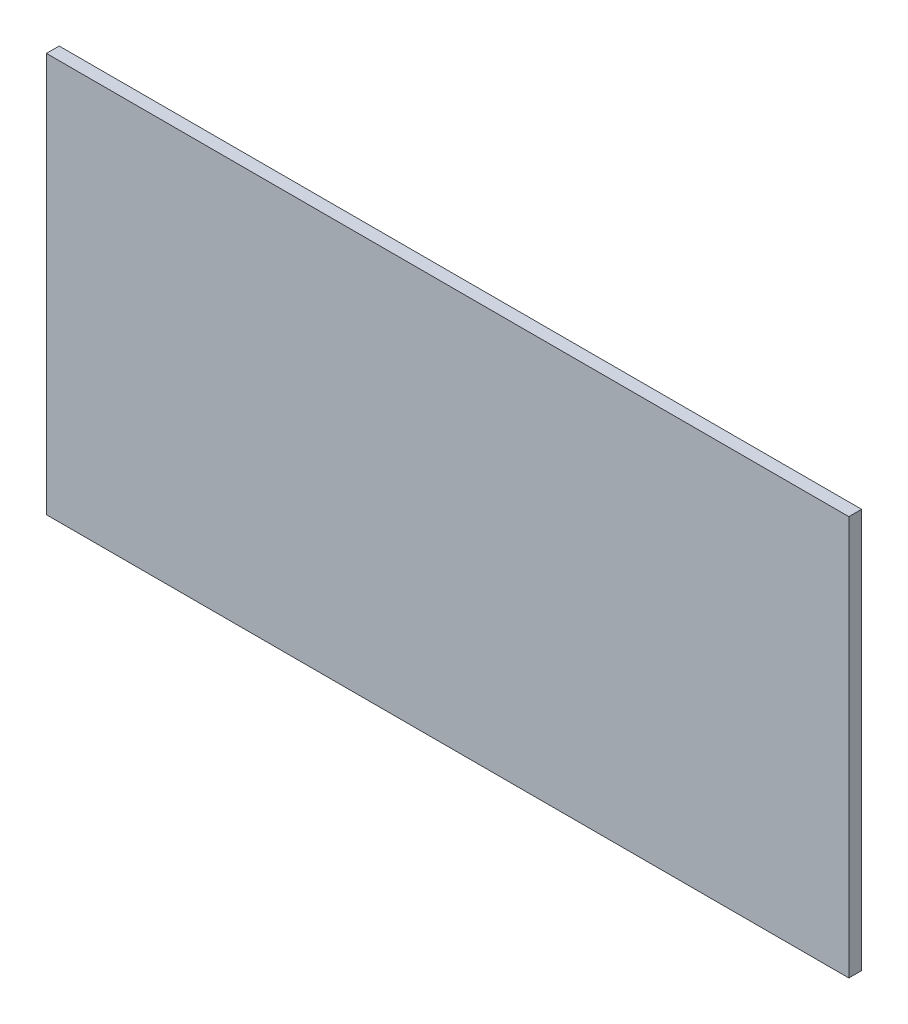
ISO-10303-21;
HEADER;
FILE_DESCRIPTION(('STEP AP214'),'2;1');
FILE_NAME('part.step','',(''),(''),'','','');
FILE_SCHEMA(('AUTOMOTIVE_DESIGN { 1 0 10303 214 1 1 1 1 }'));
ENDSEC;
DATA;
#1=APPLICATION_CONTEXT('core data for automotive mechanical design processes');
#2=APPLICATION_PROTOCOL_DEFINITION('international standard','automotive_design',2000,#1);
#3=PRODUCT_CONTEXT('',#1,'mechanical');
#4=PRODUCT('Part','Part','',(#3));
#5=PRODUCT_RELATED_PRODUCT_CATEGORY('part','',(#4));
#6=PRODUCT_DEFINITION_FORMATION('','',#4);
#7=PRODUCT_DEFINITION_CONTEXT('part definition',#1,'design');
#8=PRODUCT_DEFINITION('design','',#6,#7);
#9=PRODUCT_DEFINITION_SHAPE('','',#8);
#10=(LENGTH_UNIT() NAMED_UNIT(*) SI_UNIT(.MILLI.,.METRE.));
#11=(NAMED_UNIT(*) PLANE_ANGLE_UNIT() SI_UNIT($,.RADIAN.));
#12=(NAMED_UNIT(*) SI_UNIT($,.STERADIAN.) SOLID_ANGLE_UNIT());
#13=UNCERTAINTY_MEASURE_WITH_UNIT(LENGTH_MEASURE(1.E-05),#10,'distance_accuracy_value','');
#14=(GEOMETRIC_REPRESENTATION_CONTEXT(3) GLOBAL_UNCERTAINTY_ASSIGNED_CONTEXT((#13)) GLOBAL_UNIT_ASSIGNED_CONTEXT((#10,
#11,#12)) REPRESENTATION_CONTEXT('',''));
#15=CARTESIAN_POINT('',(0.,0.,0.));
#16=DIRECTION('',(0.,0.,1.));
#17=DIRECTION('',(1.,0.,0.));
#18=AXIS2_PLACEMENT_3D('',#15,#16,#17);
#19=CARTESIAN_POINT('',(573.88125,285.75,18.25625));
#20=DIRECTION('',(-1.,0.,0.));
#21=DIRECTION('',(0.,0.,1.));
#22=AXIS2_PLACEMENT_3D('',#19,#20,#21);
#23=PLANE('',#22);
#24=DIRECTION('',(0.,1.,0.));
#25=VECTOR('',#24,1.);
#26=CARTESIAN_POINT('',(573.88125,285.75,0.));
#27=LINE('',#26,#25);
#28=CARTESIAN_POINT('',(573.88125,-285.75,0.));
#29=VERTEX_POINT('',#28);
#30=CARTESIAN_POINT('',(573.88125,285.75,0.));
#31=VERTEX_POINT('',#30);
#32=EDGE_CURVE('E95',#29,#31,#27,.T.);
#33=ORIENTED_EDGE('',*,*,#32,.T.);
#34=DIRECTION('',(0.,0.,-1.));
#35=VECTOR('',#34,1.);
#36=CARTESIAN_POINT('',(573.88125,285.75,18.25625));
#37=LINE('',#36,#35);
#38=CARTESIAN_POINT('',(573.88125,285.75,18.25625));
#39=VERTEX_POINT('',#38);
#40=EDGE_CURVE('E11',#39,#31,#37,.T.);
#41=ORIENTED_EDGE('',*,*,#40,.F.);
#42=DIRECTION('',(0.,1.,0.));
#43=VECTOR('',#42,1.);
#44=CARTESIAN_POINT('',(573.88125,285.75,18.25625));
#45=LINE('',#44,#43);
#46=CARTESIAN_POINT('',(573.88125,-285.75,18.25625));
#47=VERTEX_POINT('',#46);
#48=EDGE_CURVE('E83',#47,#39,#45,.T.);
#49=ORIENTED_EDGE('',*,*,#48,.F.);
#50=DIRECTION('',(0.,0.,-1.));
#51=VECTOR('',#50,1.);
#52=CARTESIAN_POINT('',(573.88125,-285.75,18.25625));
#53=LINE('',#52,#51);
#54=EDGE_CURVE('E91',#47,#29,#53,.T.);
#55=ORIENTED_EDGE('',*,*,#54,.T.);
#56=EDGE_LOOP('',(#33,#41,#49,#55));
#57=FACE_BOUND('',#56,.T.);
#58=ADVANCED_FACE('F32',(#57),#23,.F.);
#59=CARTESIAN_POINT('',(-573.88125,285.75,18.25625));
#60=DIRECTION('',(0.,-1.,0.));
#61=DIRECTION('',(0.,0.,-1.));
#62=AXIS2_PLACEMENT_3D('',#59,#60,#61);
#63=PLANE('',#62);
#64=DIRECTION('',(-1.,0.,0.));
#65=VECTOR('',#64,1.);
#66=CARTESIAN_POINT('',(-573.88125,285.75,0.));
#67=LINE('',#66,#65);
#68=CARTESIAN_POINT('',(-573.88125,285.75,0.));
#69=VERTEX_POINT('',#68);
#70=EDGE_CURVE('E87',#31,#69,#67,.T.);
#71=ORIENTED_EDGE('',*,*,#70,.T.);
#72=DIRECTION('',(0.,0.,-1.));
#73=VECTOR('',#72,1.);
#74=CARTESIAN_POINT('',(-573.88125,285.75,18.25625));
#75=LINE('',#74,#73);
#76=CARTESIAN_POINT('',(-573.88125,285.75,18.25625));
#77=VERTEX_POINT('',#76);
#78=EDGE_CURVE('E40',#77,#69,#75,.T.);
#79=ORIENTED_EDGE('',*,*,#78,.F.);
#80=DIRECTION('',(-1.,0.,0.));
#81=VECTOR('',#80,1.);
#82=CARTESIAN_POINT('',(-573.88125,285.75,18.25625));
#83=LINE('',#82,#81);
#84=EDGE_CURVE('E78',#39,#77,#83,.T.);
#85=ORIENTED_EDGE('',*,*,#84,.F.);
#86=ORIENTED_EDGE('',*,*,#40,.T.);
#87=EDGE_LOOP('',(#71,#79,#85,#86));
#88=FACE_BOUND('',#87,.T.);
#89=ADVANCED_FACE('F86',(#88),#63,.F.);
#90=CARTESIAN_POINT('',(-573.88125,285.75,18.25625));
#91=DIRECTION('',(1.,0.,0.));
#92=DIRECTION('',(0.,0.,-1.));
#93=AXIS2_PLACEMENT_3D('',#90,#91,#92);
#94=PLANE('',#93);
#95=DIRECTION('',(0.,-1.,0.));
#96=VECTOR('',#95,1.);
#97=CARTESIAN_POINT('',(-573.88125,285.75,0.));
#98=LINE('',#97,#96);
#99=CARTESIAN_POINT('',(-573.88125,-285.75,0.));
#100=VERTEX_POINT('',#99);
#101=EDGE_CURVE('E65',#69,#100,#98,.T.);
#102=ORIENTED_EDGE('',*,*,#101,.T.);
#103=DIRECTION('',(0.,0.,-1.));
#104=VECTOR('',#103,1.);
#105=CARTESIAN_POINT('',(-573.88125,-285.75,18.25625));
#106=LINE('',#105,#104);
#107=CARTESIAN_POINT('',(-573.88125,-285.75,18.25625));
#108=VERTEX_POINT('',#107);
#109=EDGE_CURVE('E88',#108,#100,#106,.T.);
#110=ORIENTED_EDGE('',*,*,#109,.F.);
#111=DIRECTION('',(0.,-1.,0.));
#112=VECTOR('',#111,1.);
#113=CARTESIAN_POINT('',(-573.88125,285.75,18.25625));
#114=LINE('',#113,#112);
#115=EDGE_CURVE('E81',#77,#108,#114,.T.);
#116=ORIENTED_EDGE('',*,*,#115,.F.);
#117=ORIENTED_EDGE('',*,*,#78,.T.);
#118=EDGE_LOOP('',(#102,#110,#116,#117));
#119=FACE_BOUND('',#118,.T.);
#120=ADVANCED_FACE('F89',(#119),#94,.F.);
#121=CARTESIAN_POINT('',(-573.88125,-285.75,18.25625));
#122=DIRECTION('',(0.,1.,0.));
#123=DIRECTION('',(0.,0.,1.));
#124=AXIS2_PLACEMENT_3D('',#121,#122,#123);
#125=PLANE('',#124);
#126=DIRECTION('',(1.,0.,0.));
#127=VECTOR('',#126,1.);
#128=CARTESIAN_POINT('',(-573.88125,-285.75,0.));
#129=LINE('',#128,#127);
#130=EDGE_CURVE('E71',#100,#29,#129,.T.);
#131=ORIENTED_EDGE('',*,*,#130,.T.);
#132=ORIENTED_EDGE('',*,*,#54,.F.);
#133=DIRECTION('',(1.,0.,0.));
#134=VECTOR('',#133,1.);
#135=CARTESIAN_POINT('',(-573.88125,-285.75,18.25625));
#136=LINE('',#135,#134);
#137=EDGE_CURVE('E48',#108,#47,#136,.T.);
#138=ORIENTED_EDGE('',*,*,#137,.F.);
#139=ORIENTED_EDGE('',*,*,#109,.T.);
#140=EDGE_LOOP('',(#131,#132,#138,#139));
#141=FACE_BOUND('',#140,.T.);
#142=ADVANCED_FACE('F102',(#141),#125,.F.);
#143=CARTESIAN_POINT('',(0.,0.,18.25625));
#144=DIRECTION('',(0.,0.,1.));
#145=DIRECTION('',(1.,0.,0.));
#146=AXIS2_PLACEMENT_3D('',#143,#144,#145);
#147=PLANE('',#146);
#148=ORIENTED_EDGE('',*,*,#48,.T.);
#149=ORIENTED_EDGE('',*,*,#84,.T.);
#150=ORIENTED_EDGE('',*,*,#115,.T.);
#151=ORIENTED_EDGE('',*,*,#137,.T.);
#152=EDGE_LOOP('',(#148,#149,#150,#151));
#153=FACE_BOUND('',#152,.T.);
#154=ADVANCED_FACE('F79',(#153),#147,.T.);
#155=CARTESIAN_POINT('',(0.,0.,0.));
#156=DIRECTION('',(0.,0.,1.));
#157=DIRECTION('',(1.,0.,0.));
#158=AXIS2_PLACEMENT_3D('',#155,#156,#157);
#159=PLANE('',#158);
#160=ORIENTED_EDGE('',*,*,#32,.F.);
#161=ORIENTED_EDGE('',*,*,#130,.F.);
#162=ORIENTED_EDGE('',*,*,#101,.F.);
#163=ORIENTED_EDGE('',*,*,#70,.F.);
#164=EDGE_LOOP('',(#160,#161,#162,#163));
#165=FACE_BOUND('',#164,.T.);
#166=ADVANCED_FACE('F105',(#165),#159,.F.);
#167=CLOSED_SHELL('',(#58,#89,#120,#142,#154,#166));
#168=MANIFOLD_SOLID_BREP('B2',#167);
#169=ADVANCED_BREP_SHAPE_REPRESENTATION('',(#18,#168),#14);
#170=SHAPE_DEFINITION_REPRESENTATION(#9,#169);
ENDSEC;
END-ISO-10303-21;
